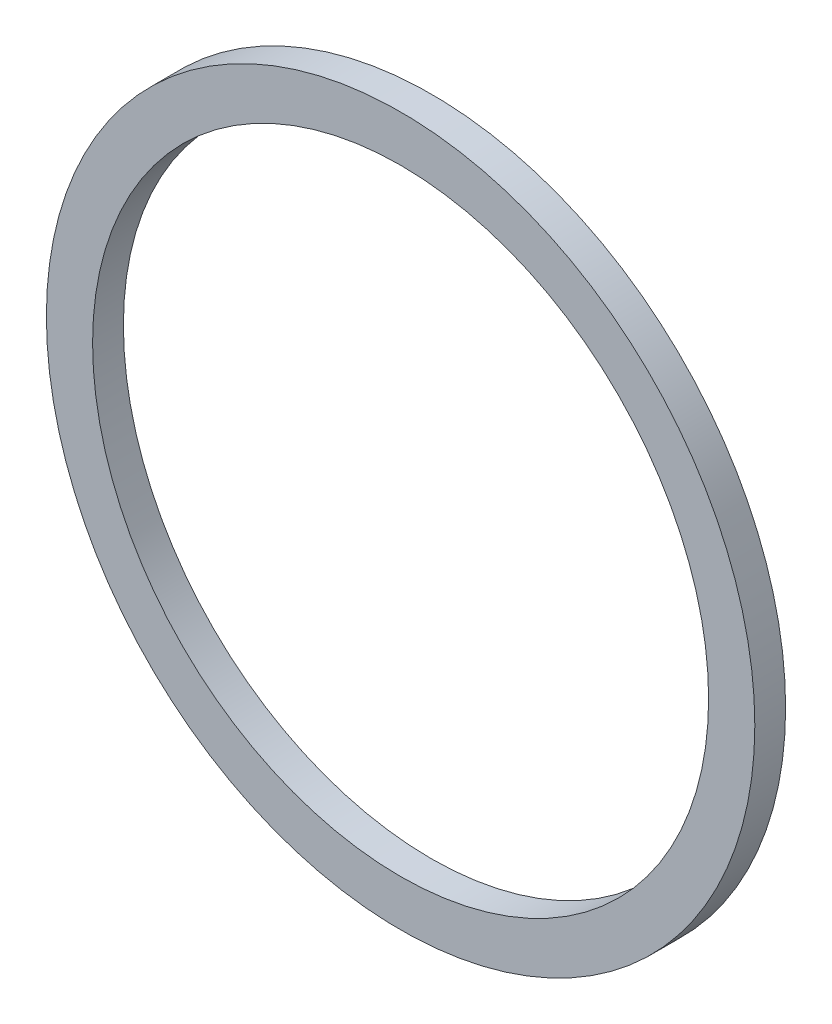
ISO-10303-21;
HEADER;
FILE_DESCRIPTION(('STEP AP214'),'2;1');
FILE_NAME('part.step','',(''),(''),'','','');
FILE_SCHEMA(('AUTOMOTIVE_DESIGN { 1 0 10303 214 1 1 1 1 }'));
ENDSEC;
DATA;
#1=APPLICATION_CONTEXT('core data for automotive mechanical design processes');
#2=APPLICATION_PROTOCOL_DEFINITION('international standard','automotive_design',2000,#1);
#3=PRODUCT_CONTEXT('',#1,'mechanical');
#4=PRODUCT('Part','Part','',(#3));
#5=PRODUCT_RELATED_PRODUCT_CATEGORY('part','',(#4));
#6=PRODUCT_DEFINITION_FORMATION('','',#4);
#7=PRODUCT_DEFINITION_CONTEXT('part definition',#1,'design');
#8=PRODUCT_DEFINITION('design','',#6,#7);
#9=PRODUCT_DEFINITION_SHAPE('','',#8);
#10=(LENGTH_UNIT() NAMED_UNIT(*) SI_UNIT(.MILLI.,.METRE.));
#11=(NAMED_UNIT(*) PLANE_ANGLE_UNIT() SI_UNIT($,.RADIAN.));
#12=(NAMED_UNIT(*) SI_UNIT($,.STERADIAN.) SOLID_ANGLE_UNIT());
#13=UNCERTAINTY_MEASURE_WITH_UNIT(LENGTH_MEASURE(1.E-05),#10,'distance_accuracy_value','');
#14=(GEOMETRIC_REPRESENTATION_CONTEXT(3) GLOBAL_UNCERTAINTY_ASSIGNED_CONTEXT((#13)) GLOBAL_UNIT_ASSIGNED_CONTEXT((#10,
#11,#12)) REPRESENTATION_CONTEXT('',''));
#15=CARTESIAN_POINT('',(0.,0.,0.));
#16=DIRECTION('',(0.,0.,1.));
#17=DIRECTION('',(1.,0.,0.));
#18=AXIS2_PLACEMENT_3D('',#15,#16,#17);
#19=CARTESIAN_POINT('',(0.,0.,1.));
#20=DIRECTION('',(0.,0.,1.));
#21=DIRECTION('',(1.,0.,0.));
#22=AXIS2_PLACEMENT_3D('',#19,#20,#21);
#23=PLANE('',#22);
#24=CARTESIAN_POINT('',(0.,0.,1.));
#25=DIRECTION('',(0.,0.,1.));
#26=DIRECTION('',(1.,0.,0.));
#27=AXIS2_PLACEMENT_3D('',#24,#25,#26);
#28=CIRCLE('',#27,11.5);
#29=CARTESIAN_POINT('',(11.5,0.,1.));
#30=VERTEX_POINT('',#29);
#31=EDGE_CURVE('E10',#30,#30,#28,.T.);
#32=ORIENTED_EDGE('',*,*,#31,.T.);
#33=EDGE_LOOP('',(#32));
#34=FACE_BOUND('',#33,.T.);
#35=CARTESIAN_POINT('',(0.,0.,1.));
#36=DIRECTION('',(0.,0.,1.));
#37=DIRECTION('',(1.,0.,0.));
#38=AXIS2_PLACEMENT_3D('',#35,#36,#37);
#39=CIRCLE('',#38,10.);
#40=CARTESIAN_POINT('',(10.,0.,1.));
#41=VERTEX_POINT('',#40);
#42=EDGE_CURVE('E50',#41,#41,#39,.T.);
#43=ORIENTED_EDGE('',*,*,#42,.F.);
#44=EDGE_LOOP('',(#43));
#45=FACE_BOUND('',#44,.T.);
#46=ADVANCED_FACE('F37',(#34,#45),#23,.T.);
#47=CARTESIAN_POINT('',(0.,0.,0.));
#48=DIRECTION('',(0.,0.,1.));
#49=DIRECTION('',(1.,0.,0.));
#50=AXIS2_PLACEMENT_3D('',#47,#48,#49);
#51=PLANE('',#50);
#52=CARTESIAN_POINT('',(0.,0.,0.));
#53=DIRECTION('',(0.,0.,1.));
#54=DIRECTION('',(1.,0.,0.));
#55=AXIS2_PLACEMENT_3D('',#52,#53,#54);
#56=CIRCLE('',#55,11.5);
#57=CARTESIAN_POINT('',(11.5,0.,0.));
#58=VERTEX_POINT('',#57);
#59=EDGE_CURVE('E41',#58,#58,#56,.T.);
#60=ORIENTED_EDGE('',*,*,#59,.F.);
#61=EDGE_LOOP('',(#60));
#62=FACE_BOUND('',#61,.T.);
#63=CARTESIAN_POINT('',(0.,0.,0.));
#64=DIRECTION('',(0.,0.,1.));
#65=DIRECTION('',(1.,0.,0.));
#66=AXIS2_PLACEMENT_3D('',#63,#64,#65);
#67=CIRCLE('',#66,10.);
#68=CARTESIAN_POINT('',(10.,0.,0.));
#69=VERTEX_POINT('',#68);
#70=EDGE_CURVE('E52',#69,#69,#67,.T.);
#71=ORIENTED_EDGE('',*,*,#70,.T.);
#72=EDGE_LOOP('',(#71));
#73=FACE_BOUND('',#72,.T.);
#74=ADVANCED_FACE('F64',(#62,#73),#51,.F.);
#75=CARTESIAN_POINT('',(0.,0.,1.));
#76=DIRECTION('',(0.,0.,-1.));
#77=DIRECTION('',(-1.,0.,0.));
#78=AXIS2_PLACEMENT_3D('',#75,#76,#77);
#79=CYLINDRICAL_SURFACE('',#78,11.5);
#80=ORIENTED_EDGE('',*,*,#31,.F.);
#81=EDGE_LOOP('',(#80));
#82=FACE_BOUND('',#81,.T.);
#83=ORIENTED_EDGE('',*,*,#59,.T.);
#84=EDGE_LOOP('',(#83));
#85=FACE_BOUND('',#84,.T.);
#86=ADVANCED_FACE('F39',(#82,#85),#79,.T.);
#87=CARTESIAN_POINT('',(0.,0.,1.));
#88=DIRECTION('',(0.,0.,-1.));
#89=DIRECTION('',(-1.,0.,0.));
#90=AXIS2_PLACEMENT_3D('',#87,#88,#89);
#91=CYLINDRICAL_SURFACE('',#90,10.);
#92=ORIENTED_EDGE('',*,*,#42,.T.);
#93=EDGE_LOOP('',(#92));
#94=FACE_BOUND('',#93,.T.);
#95=ORIENTED_EDGE('',*,*,#70,.F.);
#96=EDGE_LOOP('',(#95));
#97=FACE_BOUND('',#96,.T.);
#98=ADVANCED_FACE('F60',(#94,#97),#91,.F.);
#99=CLOSED_SHELL('',(#46,#74,#86,#98));
#100=MANIFOLD_SOLID_BREP('B2',#99);
#101=ADVANCED_BREP_SHAPE_REPRESENTATION('',(#18,#100),#14);
#102=SHAPE_DEFINITION_REPRESENTATION(#9,#101);
ENDSEC;
END-ISO-10303-21;
